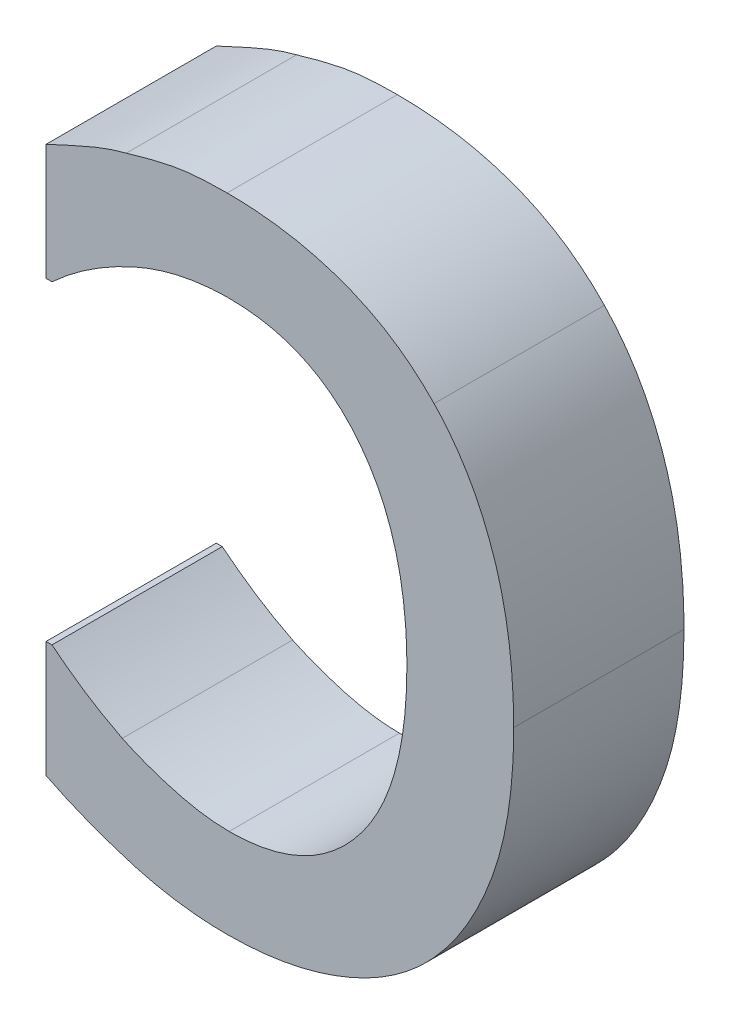
ISO-10303-21;
HEADER;
FILE_DESCRIPTION(('STEP AP214'),'2;1');
FILE_NAME('part.step','',(''),(''),'','','');
FILE_SCHEMA(('AUTOMOTIVE_DESIGN { 1 0 10303 214 1 1 1 1 }'));
ENDSEC;
DATA;
#1=APPLICATION_CONTEXT('core data for automotive mechanical design processes');
#2=APPLICATION_PROTOCOL_DEFINITION('international standard','automotive_design',2000,#1);
#3=PRODUCT_CONTEXT('',#1,'mechanical');
#4=PRODUCT('Part','Part','',(#3));
#5=PRODUCT_RELATED_PRODUCT_CATEGORY('part','',(#4));
#6=PRODUCT_DEFINITION_FORMATION('','',#4);
#7=PRODUCT_DEFINITION_CONTEXT('part definition',#1,'design');
#8=PRODUCT_DEFINITION('design','',#6,#7);
#9=PRODUCT_DEFINITION_SHAPE('','',#8);
#10=(LENGTH_UNIT() NAMED_UNIT(*) SI_UNIT(.MILLI.,.METRE.));
#11=(NAMED_UNIT(*) PLANE_ANGLE_UNIT() SI_UNIT($,.RADIAN.));
#12=(NAMED_UNIT(*) SI_UNIT($,.STERADIAN.) SOLID_ANGLE_UNIT());
#13=UNCERTAINTY_MEASURE_WITH_UNIT(LENGTH_MEASURE(1.E-05),#10,'distance_accuracy_value','');
#14=(GEOMETRIC_REPRESENTATION_CONTEXT(3) GLOBAL_UNCERTAINTY_ASSIGNED_CONTEXT((#13)) GLOBAL_UNIT_ASSIGNED_CONTEXT((#10,
#11,#12)) REPRESENTATION_CONTEXT('',''));
#15=CARTESIAN_POINT('',(0.,0.,0.));
#16=DIRECTION('',(0.,0.,1.));
#17=DIRECTION('',(1.,0.,0.));
#18=AXIS2_PLACEMENT_3D('',#15,#16,#17);
#19=CARTESIAN_POINT('',(-8.410334477411,-7.686491202905,0.));
#20=CARTESIAN_POINT('',(-8.410334477411,-7.686491202905,0.1));
#21=CARTESIAN_POINT('',(-8.410334477411,-7.638963674077,0.));
#22=CARTESIAN_POINT('',(-8.410334477411,-7.638963674077,0.1));
#23=CARTESIAN_POINT('',(-8.434877381642,-7.568061950743,0.));
#24=CARTESIAN_POINT('',(-8.434877381642,-7.568061950743,0.1));
#25=CARTESIAN_POINT('',(-8.457082866422,-7.545077326145,0.));
#26=CARTESIAN_POINT('',(-8.457082866422,-7.545077326145,0.1));
#27=B_SPLINE_SURFACE_WITH_KNOTS('',2,1,((#19,#20),(#21,#22),(#23,#24),(#25,#26)),.UNSPECIFIED.,
.F.,.F.,.F.,(3,1,3),(2,2),(-2.,-1.,0.),(0.,0.01),.UNSPECIFIED.);
#28=CARTESIAN_POINT('',(-8.457082866422,-7.545077326145,0.));
#29=CARTESIAN_POINT('',(-8.434877381642,-7.568061950743,0.));
#30=CARTESIAN_POINT('',(-8.410334477411,-7.638963674077,0.));
#31=CARTESIAN_POINT('',(-8.410334477411,-7.686491202905,0.));
#32=B_SPLINE_CURVE_WITH_KNOTS('',2,(#28,#29,#30,#31),.UNSPECIFIED.,.F.,.F.,(3,1,3),(0.,1.,2.),.UNSPECIFIED.);
#33=CARTESIAN_POINT('',(-8.457082866422,-7.545077326145,0.));
#34=VERTEX_POINT('',#33);
#35=CARTESIAN_POINT('',(-8.410334477411,-7.686491202905,0.));
#36=VERTEX_POINT('',#35);
#37=EDGE_CURVE('E11',#34,#36,#32,.T.);
#38=DIRECTION('',(0.,0.,1.));
#39=VECTOR('',#38,1.);
#40=CARTESIAN_POINT('',(-8.457082866422,-7.545077326145,0.));
#41=LINE('',#40,#39);
#42=CARTESIAN_POINT('',(-8.457082866422,-7.545077326145,0.1));
#43=VERTEX_POINT('',#42);
#44=EDGE_CURVE('E28',#34,#43,#41,.T.);
#45=CARTESIAN_POINT('',(-8.410334477411,-7.686491202905,0.1));
#46=CARTESIAN_POINT('',(-8.410334477411,-7.638963674077,0.1));
#47=CARTESIAN_POINT('',(-8.434877381642,-7.568061950743,0.1));
#48=CARTESIAN_POINT('',(-8.457082866422,-7.545077326145,0.1));
#49=B_SPLINE_CURVE_WITH_KNOTS('',2,(#45,#46,#47,#48),.UNSPECIFIED.,.F.,.F.,(3,1,3),(-2.,-1.,0.),.UNSPECIFIED.);
#50=CARTESIAN_POINT('',(-8.410334477411,-7.686491202905,0.1));
#51=VERTEX_POINT('',#50);
#52=EDGE_CURVE('E152',#51,#43,#49,.T.);
#53=DIRECTION('',(0.,0.,1.));
#54=VECTOR('',#53,1.);
#55=CARTESIAN_POINT('',(-8.410334477411,-7.686491202905,0.));
#56=LINE('',#55,#54);
#57=EDGE_CURVE('E364',#36,#51,#56,.T.);
#58=ORIENTED_EDGE('',*,*,#37,.F.);
#59=ORIENTED_EDGE('',*,*,#44,.T.);
#60=ORIENTED_EDGE('',*,*,#52,.F.);
#61=ORIENTED_EDGE('',*,*,#57,.F.);
#62=EDGE_LOOP('',(#58,#59,#60,#61));
#63=FACE_BOUND('',#62,.T.);
#64=ADVANCED_FACE('F17',(#63),#27,.T.);
#65=CARTESIAN_POINT('',(-8.457082866422,-7.826736369939,0.));
#66=CARTESIAN_POINT('',(-8.457082866422,-7.826736369939,0.1));
#67=CARTESIAN_POINT('',(-8.435656521458,-7.803362175434,0.));
#68=CARTESIAN_POINT('',(-8.435656521458,-7.803362175434,0.1));
#69=CARTESIAN_POINT('',(-8.410334477411,-7.734018731733,0.));
#70=CARTESIAN_POINT('',(-8.410334477411,-7.734018731733,0.1));
#71=CARTESIAN_POINT('',(-8.410334477411,-7.686491202905,0.));
#72=CARTESIAN_POINT('',(-8.410334477411,-7.686491202905,0.1));
#73=B_SPLINE_SURFACE_WITH_KNOTS('',2,1,((#65,#66),(#67,#68),(#69,#70),(#71,#72)),.UNSPECIFIED.,
.F.,.F.,.F.,(3,1,3),(2,2),(-2.,-1.,0.),(0.,0.01),.UNSPECIFIED.);
#74=CARTESIAN_POINT('',(-8.410334477411,-7.686491202905,0.));
#75=CARTESIAN_POINT('',(-8.410334477411,-7.734018731733,0.));
#76=CARTESIAN_POINT('',(-8.435656521458,-7.803362175434,0.));
#77=CARTESIAN_POINT('',(-8.457082866422,-7.826736369939,0.));
#78=B_SPLINE_CURVE_WITH_KNOTS('',2,(#74,#75,#76,#77),.UNSPECIFIED.,.F.,.F.,(3,1,3),(0.,1.,2.),.UNSPECIFIED.);
#79=CARTESIAN_POINT('',(-8.457082866422,-7.826736369939,0.));
#80=VERTEX_POINT('',#79);
#81=EDGE_CURVE('E357',#36,#80,#78,.T.);
#82=CARTESIAN_POINT('',(-8.457082866422,-7.826736369939,0.1));
#83=CARTESIAN_POINT('',(-8.435656521458,-7.803362175434,0.1));
#84=CARTESIAN_POINT('',(-8.410334477411,-7.734018731733,0.1));
#85=CARTESIAN_POINT('',(-8.410334477411,-7.686491202905,0.1));
#86=B_SPLINE_CURVE_WITH_KNOTS('',2,(#82,#83,#84,#85),.UNSPECIFIED.,.F.,.F.,(3,1,3),(-2.,-1.,0.),.UNSPECIFIED.);
#87=CARTESIAN_POINT('',(-8.457082866422,-7.826736369939,0.1));
#88=VERTEX_POINT('',#87);
#89=EDGE_CURVE('E353',#88,#51,#86,.T.);
#90=DIRECTION('',(0.,0.,1.));
#91=VECTOR('',#90,1.);
#92=CARTESIAN_POINT('',(-8.457082866422,-7.826736369939,0.));
#93=LINE('',#92,#91);
#94=EDGE_CURVE('E347',#80,#88,#93,.T.);
#95=ORIENTED_EDGE('',*,*,#81,.F.);
#96=ORIENTED_EDGE('',*,*,#57,.T.);
#97=ORIENTED_EDGE('',*,*,#89,.F.);
#98=ORIENTED_EDGE('',*,*,#94,.F.);
#99=EDGE_LOOP('',(#95,#96,#97,#98));
#100=FACE_BOUND('',#99,.T.);
#101=ADVANCED_FACE('F426',(#100),#73,.T.);
#102=CARTESIAN_POINT('',(-8.578628677852,-7.875822178401,0.));
#103=CARTESIAN_POINT('',(-8.578628677852,-7.875822178401,0.1));
#104=CARTESIAN_POINT('',(-8.542009106459,-7.875822178401,0.));
#105=CARTESIAN_POINT('',(-8.542009106459,-7.875822178401,0.1));
#106=CARTESIAN_POINT('',(-8.478509211386,-7.850500134354,0.));
#107=CARTESIAN_POINT('',(-8.478509211386,-7.850500134354,0.1));
#108=CARTESIAN_POINT('',(-8.457082866422,-7.826736369939,0.));
#109=CARTESIAN_POINT('',(-8.457082866422,-7.826736369939,0.1));
#110=B_SPLINE_SURFACE_WITH_KNOTS('',2,1,((#102,#103),(#104,#105),(#106,#107),(#108,#109)),
.UNSPECIFIED.,.F.,.F.,.F.,(3,1,3),(2,2),(-2.,-1.,0.),(0.,0.01),.UNSPECIFIED.);
#111=CARTESIAN_POINT('',(-8.457082866422,-7.826736369939,0.));
#112=CARTESIAN_POINT('',(-8.478509211386,-7.850500134354,0.));
#113=CARTESIAN_POINT('',(-8.542009106459,-7.875822178401,0.));
#114=CARTESIAN_POINT('',(-8.578628677852,-7.875822178401,0.));
#115=B_SPLINE_CURVE_WITH_KNOTS('',2,(#111,#112,#113,#114),.UNSPECIFIED.,.F.,.F.,(3,1,3),(0.,1.,
2.),.UNSPECIFIED.);
#116=CARTESIAN_POINT('',(-8.578628677852,-7.875822178401,0.));
#117=VERTEX_POINT('',#116);
#118=EDGE_CURVE('E340',#80,#117,#115,.T.);
#119=CARTESIAN_POINT('',(-8.578628677852,-7.875822178401,0.1));
#120=CARTESIAN_POINT('',(-8.542009106459,-7.875822178401,0.1));
#121=CARTESIAN_POINT('',(-8.478509211386,-7.850500134354,0.1));
#122=CARTESIAN_POINT('',(-8.457082866422,-7.826736369939,0.1));
#123=B_SPLINE_CURVE_WITH_KNOTS('',2,(#119,#120,#121,#122),.UNSPECIFIED.,.F.,.F.,(3,1,3),(-2.,
-1.,0.),.UNSPECIFIED.);
#124=CARTESIAN_POINT('',(-8.578628677852,-7.875822178401,0.1));
#125=VERTEX_POINT('',#124);
#126=EDGE_CURVE('E335',#125,#88,#123,.T.);
#127=DIRECTION('',(0.,0.,1.));
#128=VECTOR('',#127,1.);
#129=CARTESIAN_POINT('',(-8.578628677852,-7.875822178401,0.));
#130=LINE('',#129,#128);
#131=EDGE_CURVE('E329',#117,#125,#130,.T.);
#132=ORIENTED_EDGE('',*,*,#118,.F.);
#133=ORIENTED_EDGE('',*,*,#94,.T.);
#134=ORIENTED_EDGE('',*,*,#126,.F.);
#135=ORIENTED_EDGE('',*,*,#131,.F.);
#136=EDGE_LOOP('',(#132,#133,#134,#135));
#137=FACE_BOUND('',#136,.T.);
#138=ADVANCED_FACE('F422',(#137),#110,.T.);
#139=CARTESIAN_POINT('',(-8.684981262853,-7.848162714903,0.));
#140=CARTESIAN_POINT('',(-8.684981262853,-7.848162714903,0.1));
#141=CARTESIAN_POINT('',(-8.663554917889,-7.859070672339,0.));
#142=CARTESIAN_POINT('',(-8.663554917889,-7.859070672339,0.1));
#143=CARTESIAN_POINT('',(-8.608235990892,-7.875822178401,0.));
#144=CARTESIAN_POINT('',(-8.608235990892,-7.875822178401,0.1));
#145=CARTESIAN_POINT('',(-8.578628677852,-7.875822178401,0.));
#146=CARTESIAN_POINT('',(-8.578628677852,-7.875822178401,0.1));
#147=B_SPLINE_SURFACE_WITH_KNOTS('',2,1,((#139,#140),(#141,#142),(#143,#144),(#145,#146)),
.UNSPECIFIED.,.F.,.F.,.F.,(3,1,3),(2,2),(-2.,-1.,0.),(0.,0.01),.UNSPECIFIED.);
#148=CARTESIAN_POINT('',(-8.578628677852,-7.875822178401,0.));
#149=CARTESIAN_POINT('',(-8.608235990892,-7.875822178401,0.));
#150=CARTESIAN_POINT('',(-8.663554917889,-7.859070672339,0.));
#151=CARTESIAN_POINT('',(-8.684981262853,-7.848162714903,0.));
#152=B_SPLINE_CURVE_WITH_KNOTS('',2,(#148,#149,#150,#151),.UNSPECIFIED.,.F.,.F.,(3,1,3),(0.,1.,
2.),.UNSPECIFIED.);
#153=CARTESIAN_POINT('',(-8.684981262853,-7.848162714903,0.));
#154=VERTEX_POINT('',#153);
#155=EDGE_CURVE('E322',#117,#154,#152,.T.);
#156=CARTESIAN_POINT('',(-8.684981262853,-7.848162714903,0.1));
#157=CARTESIAN_POINT('',(-8.663554917889,-7.859070672339,0.1));
#158=CARTESIAN_POINT('',(-8.608235990892,-7.875822178401,0.1));
#159=CARTESIAN_POINT('',(-8.578628677852,-7.875822178401,0.1));
#160=B_SPLINE_CURVE_WITH_KNOTS('',2,(#156,#157,#158,#159),.UNSPECIFIED.,.F.,.F.,(3,1,3),(-2.,
-1.,0.),.UNSPECIFIED.);
#161=CARTESIAN_POINT('',(-8.684981262853,-7.848162714903,0.1));
#162=VERTEX_POINT('',#161);
#163=EDGE_CURVE('E317',#162,#125,#160,.T.);
#164=DIRECTION('',(0.,0.,1.));
#165=VECTOR('',#164,1.);
#166=CARTESIAN_POINT('',(-8.684981262853,-7.848162714903,0.));
#167=LINE('',#166,#165);
#168=EDGE_CURVE('E314',#154,#162,#167,.T.);
#169=ORIENTED_EDGE('',*,*,#155,.F.);
#170=ORIENTED_EDGE('',*,*,#131,.T.);
#171=ORIENTED_EDGE('',*,*,#163,.F.);
#172=ORIENTED_EDGE('',*,*,#168,.F.);
#173=EDGE_LOOP('',(#169,#170,#171,#172));
#174=FACE_BOUND('',#173,.T.);
#175=ADVANCED_FACE('F418',(#174),#147,.T.);
#176=CARTESIAN_POINT('',(-8.684981262853,-7.779987980928,0.));
#177=DIRECTION('',(-1.,0.,0.));
#178=DIRECTION('',(0.,-1.,0.));
#179=AXIS2_PLACEMENT_3D('',#176,#177,#178);
#180=PLANE('',#179);
#181=DIRECTION('',(0.,1.,0.));
#182=VECTOR('',#181,1.);
#183=CARTESIAN_POINT('',(-8.684981262853,-7.848162714903,0.));
#184=LINE('',#183,#182);
#185=CARTESIAN_POINT('',(-8.684981262853,-7.779987980928,0.));
#186=VERTEX_POINT('',#185);
#187=EDGE_CURVE('E312',#154,#186,#184,.T.);
#188=ORIENTED_EDGE('',*,*,#187,.F.);
#189=ORIENTED_EDGE('',*,*,#168,.T.);
#190=DIRECTION('',(0.,-1.,0.));
#191=VECTOR('',#190,1.);
#192=CARTESIAN_POINT('',(-8.684981262853,-7.848162714903,0.1));
#193=LINE('',#192,#191);
#194=CARTESIAN_POINT('',(-8.684981262853,-7.779987980928,0.1));
#195=VERTEX_POINT('',#194);
#196=EDGE_CURVE('E309',#195,#162,#193,.T.);
#197=ORIENTED_EDGE('',*,*,#196,.F.);
#198=DIRECTION('',(0.,0.,1.));
#199=VECTOR('',#198,1.);
#200=CARTESIAN_POINT('',(-8.684981262853,-7.779987980928,0.));
#201=LINE('',#200,#199);
#202=EDGE_CURVE('E306',#186,#195,#201,.T.);
#203=ORIENTED_EDGE('',*,*,#202,.F.);
#204=EDGE_LOOP('',(#188,#189,#197,#203));
#205=FACE_BOUND('',#204,.T.);
#206=ADVANCED_FACE('F414',(#205),#180,.T.);
#207=CARTESIAN_POINT('',(-8.681475133677,-7.779987980928,0.));
#208=DIRECTION('',(0.,1.,0.));
#209=DIRECTION('',(-1.,0.,0.));
#210=AXIS2_PLACEMENT_3D('',#207,#208,#209);
#211=PLANE('',#210);
#212=DIRECTION('',(1.,0.,0.));
#213=VECTOR('',#212,1.);
#214=CARTESIAN_POINT('',(-8.684981262853,-7.779987980928,0.));
#215=LINE('',#214,#213);
#216=CARTESIAN_POINT('',(-8.681475133677,-7.779987980928,0.));
#217=VERTEX_POINT('',#216);
#218=EDGE_CURVE('E304',#186,#217,#215,.T.);
#219=ORIENTED_EDGE('',*,*,#218,.F.);
#220=ORIENTED_EDGE('',*,*,#202,.T.);
#221=DIRECTION('',(-1.,0.,0.));
#222=VECTOR('',#221,1.);
#223=CARTESIAN_POINT('',(-8.684981262853,-7.779987980928,0.1));
#224=LINE('',#223,#222);
#225=CARTESIAN_POINT('',(-8.681475133677,-7.779987980928,0.1));
#226=VERTEX_POINT('',#225);
#227=EDGE_CURVE('E301',#226,#195,#224,.T.);
#228=ORIENTED_EDGE('',*,*,#227,.F.);
#229=DIRECTION('',(0.,0.,1.));
#230=VECTOR('',#229,1.);
#231=CARTESIAN_POINT('',(-8.681475133677,-7.779987980928,0.));
#232=LINE('',#231,#230);
#233=EDGE_CURVE('E295',#217,#226,#232,.T.);
#234=ORIENTED_EDGE('',*,*,#233,.F.);
#235=EDGE_LOOP('',(#219,#220,#228,#234));
#236=FACE_BOUND('',#235,.T.);
#237=ADVANCED_FACE('F410',(#236),#211,.T.);
#238=CARTESIAN_POINT('',(-8.640180723384,-7.806868304609,0.));
#239=CARTESIAN_POINT('',(-8.640180723384,-7.806868304609,0.1));
#240=CARTESIAN_POINT('',(-8.654594809995,-7.799466476349,0.));
#241=CARTESIAN_POINT('',(-8.654594809995,-7.799466476349,0.1));
#242=CARTESIAN_POINT('',(-8.674852445234,-7.785441959646,0.));
#243=CARTESIAN_POINT('',(-8.674852445234,-7.785441959646,0.1));
#244=CARTESIAN_POINT('',(-8.681475133677,-7.779987980928,0.));
#245=CARTESIAN_POINT('',(-8.681475133677,-7.779987980928,0.1));
#246=B_SPLINE_SURFACE_WITH_KNOTS('',2,1,((#238,#239),(#240,#241),(#242,#243),(#244,#245)),
.UNSPECIFIED.,.F.,.F.,.F.,(3,1,3),(2,2),(-2.,-1.,0.),(0.,0.01),.UNSPECIFIED.);
#247=CARTESIAN_POINT('',(-8.681475133677,-7.779987980928,0.));
#248=CARTESIAN_POINT('',(-8.674852445234,-7.785441959646,0.));
#249=CARTESIAN_POINT('',(-8.654594809995,-7.799466476349,0.));
#250=CARTESIAN_POINT('',(-8.640180723384,-7.806868304609,0.));
#251=B_SPLINE_CURVE_WITH_KNOTS('',2,(#247,#248,#249,#250),.UNSPECIFIED.,.F.,.F.,(3,1,3),(0.,1.,
2.),.UNSPECIFIED.);
#252=CARTESIAN_POINT('',(-8.640180723384,-7.806868304609,0.));
#253=VERTEX_POINT('',#252);
#254=EDGE_CURVE('E288',#217,#253,#251,.T.);
#255=CARTESIAN_POINT('',(-8.640180723384,-7.806868304609,0.1));
#256=CARTESIAN_POINT('',(-8.654594809995,-7.799466476349,0.1));
#257=CARTESIAN_POINT('',(-8.674852445234,-7.785441959646,0.1));
#258=CARTESIAN_POINT('',(-8.681475133677,-7.779987980928,0.1));
#259=B_SPLINE_CURVE_WITH_KNOTS('',2,(#255,#256,#257,#258),.UNSPECIFIED.,.F.,.F.,(3,1,3),(-2.,
-1.,0.),.UNSPECIFIED.);
#260=CARTESIAN_POINT('',(-8.640180723384,-7.806868304609,0.1));
#261=VERTEX_POINT('',#260);
#262=EDGE_CURVE('E283',#261,#226,#259,.T.);
#263=DIRECTION('',(0.,0.,1.));
#264=VECTOR('',#263,1.);
#265=CARTESIAN_POINT('',(-8.640180723384,-7.806868304609,0.));
#266=LINE('',#265,#264);
#267=EDGE_CURVE('E277',#253,#261,#266,.T.);
#268=ORIENTED_EDGE('',*,*,#254,.F.);
#269=ORIENTED_EDGE('',*,*,#233,.T.);
#270=ORIENTED_EDGE('',*,*,#262,.F.);
#271=ORIENTED_EDGE('',*,*,#267,.F.);
#272=EDGE_LOOP('',(#268,#269,#270,#271));
#273=FACE_BOUND('',#272,.T.);
#274=ADVANCED_FACE('F406',(#273),#246,.T.);
#275=CARTESIAN_POINT('',(-8.577459968127,-7.822840670855,0.));
#276=CARTESIAN_POINT('',(-8.577459968127,-7.822840670855,0.1));
#277=CARTESIAN_POINT('',(-8.593042764464,-7.822840670855,0.));
#278=CARTESIAN_POINT('',(-8.593042764464,-7.822840670855,0.1));
#279=CARTESIAN_POINT('',(-8.627324916405,-7.813101423144,0.));
#280=CARTESIAN_POINT('',(-8.627324916405,-7.813101423144,0.1));
#281=CARTESIAN_POINT('',(-8.640180723384,-7.806868304609,0.));
#282=CARTESIAN_POINT('',(-8.640180723384,-7.806868304609,0.1));
#283=B_SPLINE_SURFACE_WITH_KNOTS('',2,1,((#275,#276),(#277,#278),(#279,#280),(#281,#282)),
.UNSPECIFIED.,.F.,.F.,.F.,(3,1,3),(2,2),(-2.,-1.,0.),(0.,0.01),.UNSPECIFIED.);
#284=CARTESIAN_POINT('',(-8.640180723384,-7.806868304609,0.));
#285=CARTESIAN_POINT('',(-8.627324916405,-7.813101423144,0.));
#286=CARTESIAN_POINT('',(-8.593042764464,-7.822840670855,0.));
#287=CARTESIAN_POINT('',(-8.577459968127,-7.822840670855,0.));
#288=B_SPLINE_CURVE_WITH_KNOTS('',2,(#284,#285,#286,#287),.UNSPECIFIED.,.F.,.F.,(3,1,3),(0.,1.,
2.),.UNSPECIFIED.);
#289=CARTESIAN_POINT('',(-8.577459968127,-7.822840670855,0.));
#290=VERTEX_POINT('',#289);
#291=EDGE_CURVE('E270',#253,#290,#288,.T.);
#292=CARTESIAN_POINT('',(-8.577459968127,-7.822840670855,0.1));
#293=CARTESIAN_POINT('',(-8.593042764464,-7.822840670855,0.1));
#294=CARTESIAN_POINT('',(-8.627324916405,-7.813101423144,0.1));
#295=CARTESIAN_POINT('',(-8.640180723384,-7.806868304609,0.1));
#296=B_SPLINE_CURVE_WITH_KNOTS('',2,(#292,#293,#294,#295),.UNSPECIFIED.,.F.,.F.,(3,1,3),(-2.,
-1.,0.),.UNSPECIFIED.);
#297=CARTESIAN_POINT('',(-8.577459968127,-7.822840670855,0.1));
#298=VERTEX_POINT('',#297);
#299=EDGE_CURVE('E265',#298,#261,#296,.T.);
#300=DIRECTION('',(0.,0.,1.));
#301=VECTOR('',#300,1.);
#302=CARTESIAN_POINT('',(-8.577459968127,-7.822840670855,0.));
#303=LINE('',#302,#301);
#304=EDGE_CURVE('E259',#290,#298,#303,.T.);
#305=ORIENTED_EDGE('',*,*,#291,.F.);
#306=ORIENTED_EDGE('',*,*,#267,.T.);
#307=ORIENTED_EDGE('',*,*,#299,.F.);
#308=ORIENTED_EDGE('',*,*,#304,.F.);
#309=EDGE_LOOP('',(#305,#306,#307,#308));
#310=FACE_BOUND('',#309,.T.);
#311=ADVANCED_FACE('F402',(#310),#283,.T.);
#312=CARTESIAN_POINT('',(-8.473055232668,-7.686491202905,0.));
#313=CARTESIAN_POINT('',(-8.473055232668,-7.686491202905,0.1));
#314=CARTESIAN_POINT('',(-8.473055232668,-7.751549377613,0.));
#315=CARTESIAN_POINT('',(-8.473055232668,-7.751549377613,0.1));
#316=CARTESIAN_POINT('',(-8.530322009207,-7.822840670855,0.));
#317=CARTESIAN_POINT('',(-8.530322009207,-7.822840670855,0.1));
#318=CARTESIAN_POINT('',(-8.577459968127,-7.822840670855,0.));
#319=CARTESIAN_POINT('',(-8.577459968127,-7.822840670855,0.1));
#320=B_SPLINE_SURFACE_WITH_KNOTS('',2,1,((#312,#313),(#314,#315),(#316,#317),(#318,#319)),
.UNSPECIFIED.,.F.,.F.,.F.,(3,1,3),(2,2),(-2.,-1.,0.),(0.,0.01),.UNSPECIFIED.);
#321=CARTESIAN_POINT('',(-8.577459968127,-7.822840670855,0.));
#322=CARTESIAN_POINT('',(-8.530322009207,-7.822840670855,0.));
#323=CARTESIAN_POINT('',(-8.473055232668,-7.751549377613,0.));
#324=CARTESIAN_POINT('',(-8.473055232668,-7.686491202905,0.));
#325=B_SPLINE_CURVE_WITH_KNOTS('',2,(#321,#322,#323,#324),.UNSPECIFIED.,.F.,.F.,(3,1,3),(0.,1.,
2.),.UNSPECIFIED.);
#326=CARTESIAN_POINT('',(-8.473055232668,-7.686491202905,0.));
#327=VERTEX_POINT('',#326);
#328=EDGE_CURVE('E252',#290,#327,#325,.T.);
#329=CARTESIAN_POINT('',(-8.473055232668,-7.686491202905,0.1));
#330=CARTESIAN_POINT('',(-8.473055232668,-7.751549377613,0.1));
#331=CARTESIAN_POINT('',(-8.530322009207,-7.822840670855,0.1));
#332=CARTESIAN_POINT('',(-8.577459968127,-7.822840670855,0.1));
#333=B_SPLINE_CURVE_WITH_KNOTS('',2,(#329,#330,#331,#332),.UNSPECIFIED.,.F.,.F.,(3,1,3),(-2.,
-1.,0.),.UNSPECIFIED.);
#334=CARTESIAN_POINT('',(-8.473055232668,-7.686491202905,0.1));
#335=VERTEX_POINT('',#334);
#336=EDGE_CURVE('E247',#335,#298,#333,.T.);
#337=DIRECTION('',(0.,0.,1.));
#338=VECTOR('',#337,1.);
#339=CARTESIAN_POINT('',(-8.473055232668,-7.686491202905,0.));
#340=LINE('',#339,#338);
#341=EDGE_CURVE('E241',#327,#335,#340,.T.);
#342=ORIENTED_EDGE('',*,*,#328,.F.);
#343=ORIENTED_EDGE('',*,*,#304,.T.);
#344=ORIENTED_EDGE('',*,*,#336,.F.);
#345=ORIENTED_EDGE('',*,*,#341,.F.);
#346=EDGE_LOOP('',(#342,#343,#344,#345));
#347=FACE_BOUND('',#346,.T.);
#348=ADVANCED_FACE('F398',(#347),#320,.T.);
#349=CARTESIAN_POINT('',(-8.577459968127,-7.551700014589,0.));
#350=CARTESIAN_POINT('',(-8.577459968127,-7.551700014589,0.1));
#351=CARTESIAN_POINT('',(-8.528374159665,-7.551700014589,0.));
#352=CARTESIAN_POINT('',(-8.528374159665,-7.551700014589,0.1));
#353=CARTESIAN_POINT('',(-8.473055232668,-7.622991307831,0.));
#354=CARTESIAN_POINT('',(-8.473055232668,-7.622991307831,0.1));
#355=CARTESIAN_POINT('',(-8.473055232668,-7.686491202905,0.));
#356=CARTESIAN_POINT('',(-8.473055232668,-7.686491202905,0.1));
#357=B_SPLINE_SURFACE_WITH_KNOTS('',2,1,((#349,#350),(#351,#352),(#353,#354),(#355,#356)),
.UNSPECIFIED.,.F.,.F.,.F.,(3,1,3),(2,2),(-2.,-1.,0.),(0.,0.01),.UNSPECIFIED.);
#358=CARTESIAN_POINT('',(-8.473055232668,-7.686491202905,0.));
#359=CARTESIAN_POINT('',(-8.473055232668,-7.622991307831,0.));
#360=CARTESIAN_POINT('',(-8.528374159665,-7.551700014589,0.));
#361=CARTESIAN_POINT('',(-8.577459968127,-7.551700014589,0.));
#362=B_SPLINE_CURVE_WITH_KNOTS('',2,(#358,#359,#360,#361),.UNSPECIFIED.,.F.,.F.,(3,1,3),(0.,1.,
2.),.UNSPECIFIED.);
#363=CARTESIAN_POINT('',(-8.577459968127,-7.551700014589,0.));
#364=VERTEX_POINT('',#363);
#365=EDGE_CURVE('E234',#327,#364,#362,.T.);
#366=CARTESIAN_POINT('',(-8.577459968127,-7.551700014589,0.1));
#367=CARTESIAN_POINT('',(-8.528374159665,-7.551700014589,0.1));
#368=CARTESIAN_POINT('',(-8.473055232668,-7.622991307831,0.1));
#369=CARTESIAN_POINT('',(-8.473055232668,-7.686491202905,0.1));
#370=B_SPLINE_CURVE_WITH_KNOTS('',2,(#366,#367,#368,#369),.UNSPECIFIED.,.F.,.F.,(3,1,3),(-2.,
-1.,0.),.UNSPECIFIED.);
#371=CARTESIAN_POINT('',(-8.577459968127,-7.551700014589,0.1));
#372=VERTEX_POINT('',#371);
#373=EDGE_CURVE('E229',#372,#335,#370,.T.);
#374=DIRECTION('',(0.,0.,1.));
#375=VECTOR('',#374,1.);
#376=CARTESIAN_POINT('',(-8.577459968127,-7.551700014589,0.));
#377=LINE('',#376,#375);
#378=EDGE_CURVE('E223',#364,#372,#377,.T.);
#379=ORIENTED_EDGE('',*,*,#365,.F.);
#380=ORIENTED_EDGE('',*,*,#341,.T.);
#381=ORIENTED_EDGE('',*,*,#373,.F.);
#382=ORIENTED_EDGE('',*,*,#378,.F.);
#383=EDGE_LOOP('',(#379,#380,#381,#382));
#384=FACE_BOUND('',#383,.T.);
#385=ADVANCED_FACE('F394',(#384),#357,.T.);
#386=CARTESIAN_POINT('',(-8.681475133677,-7.595331844333,0.));
#387=CARTESIAN_POINT('',(-8.681475133677,-7.595331844333,0.1));
#388=CARTESIAN_POINT('',(-8.66082792853,-7.57624291882,0.));
#389=CARTESIAN_POINT('',(-8.66082792853,-7.57624291882,0.1));
#390=CARTESIAN_POINT('',(-8.607067281167,-7.551700014589,0.));
#391=CARTESIAN_POINT('',(-8.607067281167,-7.551700014589,0.1));
#392=CARTESIAN_POINT('',(-8.577459968127,-7.551700014589,0.));
#393=CARTESIAN_POINT('',(-8.577459968127,-7.551700014589,0.1));
#394=B_SPLINE_SURFACE_WITH_KNOTS('',2,1,((#386,#387),(#388,#389),(#390,#391),(#392,#393)),
.UNSPECIFIED.,.F.,.F.,.F.,(3,1,3),(2,2),(-2.,-1.,0.),(0.,0.01),.UNSPECIFIED.);
#395=CARTESIAN_POINT('',(-8.577459968127,-7.551700014589,0.));
#396=CARTESIAN_POINT('',(-8.607067281167,-7.551700014589,0.));
#397=CARTESIAN_POINT('',(-8.66082792853,-7.57624291882,0.));
#398=CARTESIAN_POINT('',(-8.681475133677,-7.595331844333,0.));
#399=B_SPLINE_CURVE_WITH_KNOTS('',2,(#395,#396,#397,#398),.UNSPECIFIED.,.F.,.F.,(3,1,3),(0.,1.,
2.),.UNSPECIFIED.);
#400=CARTESIAN_POINT('',(-8.681475133677,-7.595331844333,0.));
#401=VERTEX_POINT('',#400);
#402=EDGE_CURVE('E216',#364,#401,#399,.T.);
#403=CARTESIAN_POINT('',(-8.681475133677,-7.595331844333,0.1));
#404=CARTESIAN_POINT('',(-8.66082792853,-7.57624291882,0.1));
#405=CARTESIAN_POINT('',(-8.607067281167,-7.551700014589,0.1));
#406=CARTESIAN_POINT('',(-8.577459968127,-7.551700014589,0.1));
#407=B_SPLINE_CURVE_WITH_KNOTS('',2,(#403,#404,#405,#406),.UNSPECIFIED.,.F.,.F.,(3,1,3),(-2.,
-1.,0.),.UNSPECIFIED.);
#408=CARTESIAN_POINT('',(-8.681475133677,-7.595331844333,0.1));
#409=VERTEX_POINT('',#408);
#410=EDGE_CURVE('E211',#409,#372,#407,.T.);
#411=DIRECTION('',(0.,0.,1.));
#412=VECTOR('',#411,1.);
#413=CARTESIAN_POINT('',(-8.681475133677,-7.595331844333,0.));
#414=LINE('',#413,#412);
#415=EDGE_CURVE('E208',#401,#409,#414,.T.);
#416=ORIENTED_EDGE('',*,*,#402,.F.);
#417=ORIENTED_EDGE('',*,*,#378,.T.);
#418=ORIENTED_EDGE('',*,*,#410,.F.);
#419=ORIENTED_EDGE('',*,*,#415,.F.);
#420=EDGE_LOOP('',(#416,#417,#418,#419));
#421=FACE_BOUND('',#420,.T.);
#422=ADVANCED_FACE('F390',(#421),#394,.T.);
#423=CARTESIAN_POINT('',(-8.684981262853,-7.595331844333,0.));
#424=DIRECTION('',(0.,-1.,0.));
#425=DIRECTION('',(1.,0.,0.));
#426=AXIS2_PLACEMENT_3D('',#423,#424,#425);
#427=PLANE('',#426);
#428=DIRECTION('',(-1.,0.,0.));
#429=VECTOR('',#428,1.);
#430=CARTESIAN_POINT('',(-8.681475133677,-7.595331844333,0.));
#431=LINE('',#430,#429);
#432=CARTESIAN_POINT('',(-8.684981262853,-7.595331844333,0.));
#433=VERTEX_POINT('',#432);
#434=EDGE_CURVE('E206',#401,#433,#431,.T.);
#435=ORIENTED_EDGE('',*,*,#434,.F.);
#436=ORIENTED_EDGE('',*,*,#415,.T.);
#437=DIRECTION('',(1.,0.,0.));
#438=VECTOR('',#437,1.);
#439=CARTESIAN_POINT('',(-8.681475133677,-7.595331844333,0.1));
#440=LINE('',#439,#438);
#441=CARTESIAN_POINT('',(-8.684981262853,-7.595331844333,0.1));
#442=VERTEX_POINT('',#441);
#443=EDGE_CURVE('E203',#442,#409,#440,.T.);
#444=ORIENTED_EDGE('',*,*,#443,.F.);
#445=DIRECTION('',(0.,0.,1.));
#446=VECTOR('',#445,1.);
#447=CARTESIAN_POINT('',(-8.684981262853,-7.595331844333,0.));
#448=LINE('',#447,#446);
#449=EDGE_CURVE('E200',#433,#442,#448,.T.);
#450=ORIENTED_EDGE('',*,*,#449,.F.);
#451=EDGE_LOOP('',(#435,#436,#444,#450));
#452=FACE_BOUND('',#451,.T.);
#453=ADVANCED_FACE('F386',(#452),#427,.T.);
#454=CARTESIAN_POINT('',(-8.684981262853,-7.527157110358,0.));
#455=DIRECTION('',(-1.,0.,0.));
#456=DIRECTION('',(0.,-1.,0.));
#457=AXIS2_PLACEMENT_3D('',#454,#455,#456);
#458=PLANE('',#457);
#459=DIRECTION('',(0.,1.,0.));
#460=VECTOR('',#459,1.);
#461=CARTESIAN_POINT('',(-8.684981262853,-7.595331844333,0.));
#462=LINE('',#461,#460);
#463=CARTESIAN_POINT('',(-8.684981262853,-7.527157110358,0.));
#464=VERTEX_POINT('',#463);
#465=EDGE_CURVE('E198',#433,#464,#462,.T.);
#466=ORIENTED_EDGE('',*,*,#465,.F.);
#467=ORIENTED_EDGE('',*,*,#449,.T.);
#468=DIRECTION('',(0.,-1.,0.));
#469=VECTOR('',#468,1.);
#470=CARTESIAN_POINT('',(-8.684981262853,-7.595331844333,0.1));
#471=LINE('',#470,#469);
#472=CARTESIAN_POINT('',(-8.684981262853,-7.527157110358,0.1));
#473=VERTEX_POINT('',#472);
#474=EDGE_CURVE('E195',#473,#442,#471,.T.);
#475=ORIENTED_EDGE('',*,*,#474,.F.);
#476=DIRECTION('',(0.,0.,1.));
#477=VECTOR('',#476,1.);
#478=CARTESIAN_POINT('',(-8.684981262853,-7.527157110358,0.));
#479=LINE('',#478,#477);
#480=EDGE_CURVE('E189',#464,#473,#479,.T.);
#481=ORIENTED_EDGE('',*,*,#480,.F.);
#482=EDGE_LOOP('',(#466,#467,#475,#481));
#483=FACE_BOUND('',#482,.T.);
#484=ADVANCED_FACE('F382',(#483),#458,.T.);
#485=CARTESIAN_POINT('',(-8.637843303933,-7.508068184845,0.));
#486=CARTESIAN_POINT('',(-8.637843303933,-7.508068184845,0.1));
#487=CARTESIAN_POINT('',(-8.648751261369,-7.510795174204,0.));
#488=CARTESIAN_POINT('',(-8.648751261369,-7.510795174204,0.1));
#489=CARTESIAN_POINT('',(-8.676021154959,-7.522871841365,0.));
#490=CARTESIAN_POINT('',(-8.676021154959,-7.522871841365,0.1));
#491=CARTESIAN_POINT('',(-8.684981262853,-7.527157110358,0.));
#492=CARTESIAN_POINT('',(-8.684981262853,-7.527157110358,0.1));
#493=B_SPLINE_SURFACE_WITH_KNOTS('',2,1,((#485,#486),(#487,#488),(#489,#490),(#491,#492)),
.UNSPECIFIED.,.F.,.F.,.F.,(3,1,3),(2,2),(-2.,-1.,0.),(0.,0.01),.UNSPECIFIED.);
#494=CARTESIAN_POINT('',(-8.684981262853,-7.527157110358,0.));
#495=CARTESIAN_POINT('',(-8.676021154959,-7.522871841365,0.));
#496=CARTESIAN_POINT('',(-8.648751261369,-7.510795174204,0.));
#497=CARTESIAN_POINT('',(-8.637843303933,-7.508068184845,0.));
#498=B_SPLINE_CURVE_WITH_KNOTS('',2,(#494,#495,#496,#497),.UNSPECIFIED.,.F.,.F.,(3,1,3),(0.,1.,
2.),.UNSPECIFIED.);
#499=CARTESIAN_POINT('',(-8.637843303933,-7.508068184845,0.));
#500=VERTEX_POINT('',#499);
#501=EDGE_CURVE('E182',#464,#500,#498,.T.);
#502=CARTESIAN_POINT('',(-8.637843303933,-7.508068184845,0.1));
#503=CARTESIAN_POINT('',(-8.648751261369,-7.510795174204,0.1));
#504=CARTESIAN_POINT('',(-8.676021154959,-7.522871841365,0.1));
#505=CARTESIAN_POINT('',(-8.684981262853,-7.527157110358,0.1));
#506=B_SPLINE_CURVE_WITH_KNOTS('',2,(#502,#503,#504,#505),.UNSPECIFIED.,.F.,.F.,(3,1,3),(-2.,
-1.,0.),.UNSPECIFIED.);
#507=CARTESIAN_POINT('',(-8.637843303933,-7.508068184845,0.1));
#508=VERTEX_POINT('',#507);
#509=EDGE_CURVE('E178',#508,#473,#506,.T.);
#510=DIRECTION('',(0.,0.,1.));
#511=VECTOR('',#510,1.);
#512=CARTESIAN_POINT('',(-8.637843303933,-7.508068184845,0.));
#513=LINE('',#512,#511);
#514=EDGE_CURVE('E137',#500,#508,#513,.T.);
#515=ORIENTED_EDGE('',*,*,#501,.F.);
#516=ORIENTED_EDGE('',*,*,#480,.T.);
#517=ORIENTED_EDGE('',*,*,#509,.F.);
#518=ORIENTED_EDGE('',*,*,#514,.F.);
#519=EDGE_LOOP('',(#515,#516,#517,#518));
#520=FACE_BOUND('',#519,.T.);
#521=ADVANCED_FACE('F380',(#520),#493,.T.);
#522=CARTESIAN_POINT('',(-8.578628677852,-7.498718507042,0.));
#523=CARTESIAN_POINT('',(-8.578628677852,-7.498718507042,0.1));
#524=CARTESIAN_POINT('',(-8.597717603365,-7.498718507042,0.));
#525=CARTESIAN_POINT('',(-8.597717603365,-7.498718507042,0.1));
#526=CARTESIAN_POINT('',(-8.622260507596,-7.503393345943,0.));
#527=CARTESIAN_POINT('',(-8.622260507596,-7.503393345943,0.1));
#528=CARTESIAN_POINT('',(-8.637843303933,-7.508068184845,0.));
#529=CARTESIAN_POINT('',(-8.637843303933,-7.508068184845,0.1));
#530=B_SPLINE_SURFACE_WITH_KNOTS('',2,1,((#522,#523),(#524,#525),(#526,#527),(#528,#529)),
.UNSPECIFIED.,.F.,.F.,.F.,(3,1,3),(2,2),(-2.,-1.,0.),(0.,0.01),.UNSPECIFIED.);
#531=CARTESIAN_POINT('',(-8.637843303933,-7.508068184845,0.));
#532=CARTESIAN_POINT('',(-8.622260507596,-7.503393345943,0.));
#533=CARTESIAN_POINT('',(-8.597717603365,-7.498718507042,0.));
#534=CARTESIAN_POINT('',(-8.578628677852,-7.498718507042,0.));
#535=B_SPLINE_CURVE_WITH_KNOTS('',2,(#531,#532,#533,#534),.UNSPECIFIED.,.F.,.F.,(3,1,3),(0.,1.,
2.),.UNSPECIFIED.);
#536=CARTESIAN_POINT('',(-8.578628677852,-7.498718507042,0.));
#537=VERTEX_POINT('',#536);
#538=EDGE_CURVE('E141',#500,#537,#535,.T.);
#539=CARTESIAN_POINT('',(-8.578628677852,-7.498718507042,0.1));
#540=CARTESIAN_POINT('',(-8.597717603365,-7.498718507042,0.1));
#541=CARTESIAN_POINT('',(-8.622260507596,-7.503393345943,0.1));
#542=CARTESIAN_POINT('',(-8.637843303933,-7.508068184845,0.1));
#543=B_SPLINE_CURVE_WITH_KNOTS('',2,(#539,#540,#541,#542),.UNSPECIFIED.,.F.,.F.,(3,1,3),(-2.,
-1.,0.),.UNSPECIFIED.);
#544=CARTESIAN_POINT('',(-8.578628677852,-7.498718507042,0.1));
#545=VERTEX_POINT('',#544);
#546=EDGE_CURVE('E130',#545,#508,#543,.T.);
#547=DIRECTION('',(0.,0.,1.));
#548=VECTOR('',#547,1.);
#549=CARTESIAN_POINT('',(-8.578628677852,-7.498718507042,0.));
#550=LINE('',#549,#548);
#551=EDGE_CURVE('E134',#537,#545,#550,.T.);
#552=ORIENTED_EDGE('',*,*,#538,.F.);
#553=ORIENTED_EDGE('',*,*,#514,.T.);
#554=ORIENTED_EDGE('',*,*,#546,.F.);
#555=ORIENTED_EDGE('',*,*,#551,.F.);
#556=EDGE_LOOP('',(#552,#553,#554,#555));
#557=FACE_BOUND('',#556,.T.);
#558=ADVANCED_FACE('F133',(#557),#530,.T.);
#559=CARTESIAN_POINT('',(-8.457082866422,-7.545077326145,0.));
#560=CARTESIAN_POINT('',(-8.457082866422,-7.545077326145,0.1));
#561=CARTESIAN_POINT('',(-8.479288351202,-7.52170313164,0.));
#562=CARTESIAN_POINT('',(-8.479288351202,-7.52170313164,0.1));
#563=CARTESIAN_POINT('',(-8.541229966643,-7.498718507042,0.));
#564=CARTESIAN_POINT('',(-8.541229966643,-7.498718507042,0.1));
#565=CARTESIAN_POINT('',(-8.578628677852,-7.498718507042,0.));
#566=CARTESIAN_POINT('',(-8.578628677852,-7.498718507042,0.1));
#567=B_SPLINE_SURFACE_WITH_KNOTS('',2,1,((#559,#560),(#561,#562),(#563,#564),(#565,#566)),
.UNSPECIFIED.,.F.,.F.,.F.,(3,1,3),(2,2),(-2.,-1.,0.),(0.,0.01),.UNSPECIFIED.);
#568=CARTESIAN_POINT('',(-8.578628677852,-7.498718507042,0.));
#569=CARTESIAN_POINT('',(-8.541229966643,-7.498718507042,0.));
#570=CARTESIAN_POINT('',(-8.479288351202,-7.52170313164,0.));
#571=CARTESIAN_POINT('',(-8.457082866422,-7.545077326145,0.));
#572=B_SPLINE_CURVE_WITH_KNOTS('',2,(#568,#569,#570,#571),.UNSPECIFIED.,.F.,.F.,(3,1,3),(0.,1.,
2.),.UNSPECIFIED.);
#573=EDGE_CURVE('E147',#537,#34,#572,.T.);
#574=CARTESIAN_POINT('',(-8.457082866422,-7.545077326145,0.1));
#575=CARTESIAN_POINT('',(-8.479288351202,-7.52170313164,0.1));
#576=CARTESIAN_POINT('',(-8.541229966643,-7.498718507042,0.1));
#577=CARTESIAN_POINT('',(-8.578628677852,-7.498718507042,0.1));
#578=B_SPLINE_CURVE_WITH_KNOTS('',2,(#574,#575,#576,#577),.UNSPECIFIED.,.F.,.F.,(3,1,3),(-2.,
-1.,0.),.UNSPECIFIED.);
#579=EDGE_CURVE('E146',#43,#545,#578,.T.);
#580=ORIENTED_EDGE('',*,*,#573,.F.);
#581=ORIENTED_EDGE('',*,*,#551,.T.);
#582=ORIENTED_EDGE('',*,*,#579,.F.);
#583=ORIENTED_EDGE('',*,*,#44,.F.);
#584=EDGE_LOOP('',(#580,#581,#582,#583));
#585=FACE_BOUND('',#584,.T.);
#586=ADVANCED_FACE('F145',(#585),#567,.T.);
#587=CARTESIAN_POINT('',(-8.549108848536,-7.68688841653,0.));
#588=DIRECTION('',(0.,0.,1.));
#589=DIRECTION('',(1.,0.,0.));
#590=AXIS2_PLACEMENT_3D('',#587,#588,#589);
#591=PLANE('',#590);
#592=ORIENTED_EDGE('',*,*,#573,.T.);
#593=ORIENTED_EDGE('',*,*,#37,.T.);
#594=ORIENTED_EDGE('',*,*,#81,.T.);
#595=ORIENTED_EDGE('',*,*,#118,.T.);
#596=ORIENTED_EDGE('',*,*,#155,.T.);
#597=ORIENTED_EDGE('',*,*,#187,.T.);
#598=ORIENTED_EDGE('',*,*,#218,.T.);
#599=ORIENTED_EDGE('',*,*,#254,.T.);
#600=ORIENTED_EDGE('',*,*,#291,.T.);
#601=ORIENTED_EDGE('',*,*,#328,.T.);
#602=ORIENTED_EDGE('',*,*,#365,.T.);
#603=ORIENTED_EDGE('',*,*,#402,.T.);
#604=ORIENTED_EDGE('',*,*,#434,.T.);
#605=ORIENTED_EDGE('',*,*,#465,.T.);
#606=ORIENTED_EDGE('',*,*,#501,.T.);
#607=ORIENTED_EDGE('',*,*,#538,.T.);
#608=EDGE_LOOP('',(#592,#593,#594,#595,#596,#597,#598,#599,#600,#601,#602,#603,#604,#605,#606,#607));
#609=FACE_BOUND('',#608,.T.);
#610=ADVANCED_FACE('F375',(#609),#591,.F.);
#611=CARTESIAN_POINT('',(-8.549108848536,-7.68688841653,0.1));
#612=DIRECTION('',(0.,0.,1.));
#613=DIRECTION('',(1.,0.,0.));
#614=AXIS2_PLACEMENT_3D('',#611,#612,#613);
#615=PLANE('',#614);
#616=ORIENTED_EDGE('',*,*,#579,.T.);
#617=ORIENTED_EDGE('',*,*,#546,.T.);
#618=ORIENTED_EDGE('',*,*,#509,.T.);
#619=ORIENTED_EDGE('',*,*,#474,.T.);
#620=ORIENTED_EDGE('',*,*,#443,.T.);
#621=ORIENTED_EDGE('',*,*,#410,.T.);
#622=ORIENTED_EDGE('',*,*,#373,.T.);
#623=ORIENTED_EDGE('',*,*,#336,.T.);
#624=ORIENTED_EDGE('',*,*,#299,.T.);
#625=ORIENTED_EDGE('',*,*,#262,.T.);
#626=ORIENTED_EDGE('',*,*,#227,.T.);
#627=ORIENTED_EDGE('',*,*,#196,.T.);
#628=ORIENTED_EDGE('',*,*,#163,.T.);
#629=ORIENTED_EDGE('',*,*,#126,.T.);
#630=ORIENTED_EDGE('',*,*,#89,.T.);
#631=ORIENTED_EDGE('',*,*,#52,.T.);
#632=EDGE_LOOP('',(#616,#617,#618,#619,#620,#621,#622,#623,#624,#625,#626,#627,#628,#629,#630,#631));
#633=FACE_BOUND('',#632,.T.);
#634=ADVANCED_FACE('F150',(#633),#615,.T.);
#635=CLOSED_SHELL('',(#64,#101,#138,#175,#206,#237,#274,#311,#348,#385,#422,#453,#484,#521,#558,
#586,#610,#634));
#636=MANIFOLD_SOLID_BREP('B1',#635);
#637=ADVANCED_BREP_SHAPE_REPRESENTATION('',(#18,#636),#14);
#638=SHAPE_DEFINITION_REPRESENTATION(#9,#637);
ENDSEC;
END-ISO-10303-21;
